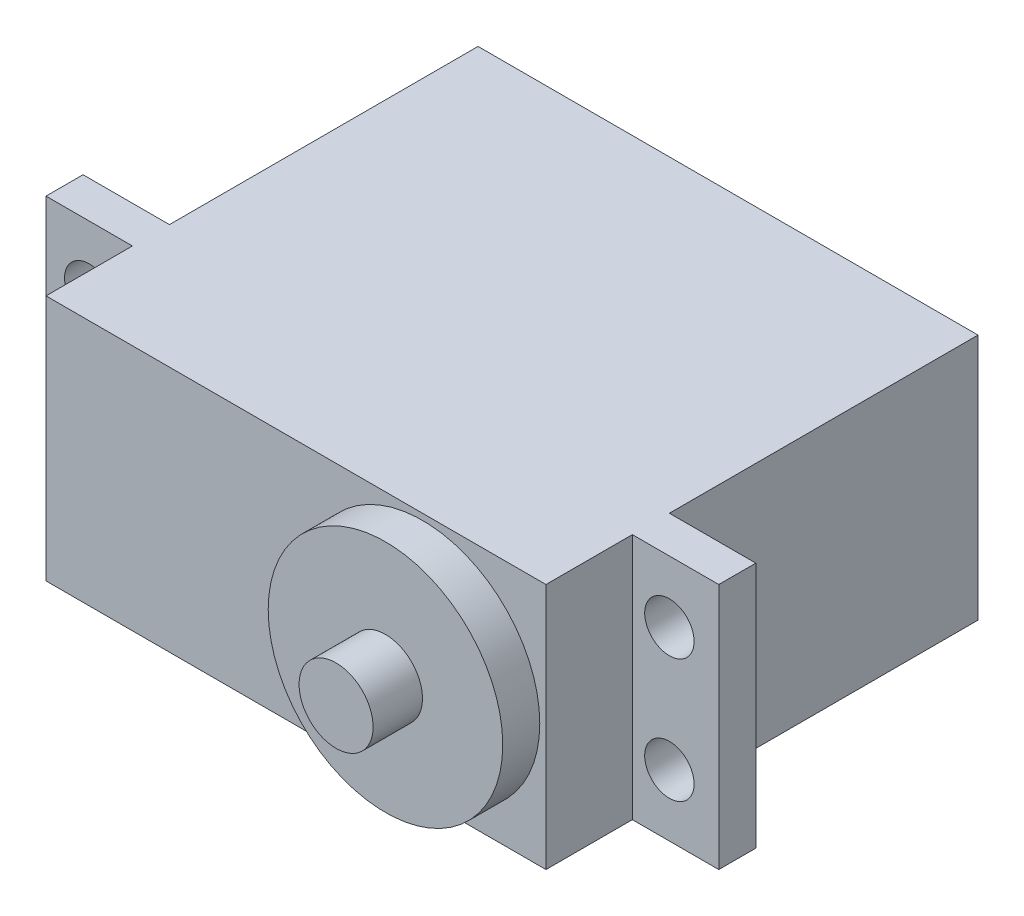
ISO-10303-21;
HEADER;
FILE_DESCRIPTION(('STEP AP214'),'2;1');
FILE_NAME('part.step','',(''),(''),'','','');
FILE_SCHEMA(('AUTOMOTIVE_DESIGN { 1 0 10303 214 1 1 1 1 }'));
ENDSEC;
DATA;
#1=APPLICATION_CONTEXT('core data for automotive mechanical design processes');
#2=APPLICATION_PROTOCOL_DEFINITION('international standard','automotive_design',2000,#1);
#3=PRODUCT_CONTEXT('',#1,'mechanical');
#4=PRODUCT('Part','Part','',(#3));
#5=PRODUCT_RELATED_PRODUCT_CATEGORY('part','',(#4));
#6=PRODUCT_DEFINITION_FORMATION('','',#4);
#7=PRODUCT_DEFINITION_CONTEXT('part definition',#1,'design');
#8=PRODUCT_DEFINITION('design','',#6,#7);
#9=PRODUCT_DEFINITION_SHAPE('','',#8);
#10=(LENGTH_UNIT() NAMED_UNIT(*) SI_UNIT(.MILLI.,.METRE.));
#11=(NAMED_UNIT(*) PLANE_ANGLE_UNIT() SI_UNIT($,.RADIAN.));
#12=(NAMED_UNIT(*) SI_UNIT($,.STERADIAN.) SOLID_ANGLE_UNIT());
#13=UNCERTAINTY_MEASURE_WITH_UNIT(LENGTH_MEASURE(1.E-05),#10,'distance_accuracy_value','');
#14=(GEOMETRIC_REPRESENTATION_CONTEXT(3) GLOBAL_UNCERTAINTY_ASSIGNED_CONTEXT((#13)) GLOBAL_UNIT_ASSIGNED_CONTEXT((#10,
#11,#12)) REPRESENTATION_CONTEXT('',''));
#15=CARTESIAN_POINT('',(0.,0.,0.));
#16=DIRECTION('',(0.,0.,1.));
#17=DIRECTION('',(1.,0.,0.));
#18=AXIS2_PLACEMENT_3D('',#15,#16,#17);
#19=CARTESIAN_POINT('',(-30.5,-10.,35.));
#20=DIRECTION('',(1.,0.,0.));
#21=DIRECTION('',(0.,0.,-1.));
#22=AXIS2_PLACEMENT_3D('',#19,#20,#21);
#23=PLANE('',#22);
#24=DIRECTION('',(0.,1.,0.));
#25=VECTOR('',#24,1.);
#26=CARTESIAN_POINT('',(-30.5,-10.,28.));
#27=LINE('',#26,#25);
#28=CARTESIAN_POINT('',(-30.5,-10.,28.));
#29=VERTEX_POINT('',#28);
#30=CARTESIAN_POINT('',(-30.5,10.,28.));
#31=VERTEX_POINT('',#30);
#32=EDGE_CURVE('E175',#29,#31,#27,.T.);
#33=ORIENTED_EDGE('',*,*,#32,.F.);
#34=DIRECTION('',(0.,0.,-1.));
#35=VECTOR('',#34,1.);
#36=CARTESIAN_POINT('',(-30.5,-10.,35.));
#37=LINE('',#36,#35);
#38=CARTESIAN_POINT('',(-30.5,-10.,35.));
#39=VERTEX_POINT('',#38);
#40=EDGE_CURVE('E144',#39,#29,#37,.T.);
#41=ORIENTED_EDGE('',*,*,#40,.F.);
#42=DIRECTION('',(0.,-1.,0.));
#43=VECTOR('',#42,1.);
#44=CARTESIAN_POINT('',(-30.5,-10.,35.));
#45=LINE('',#44,#43);
#46=CARTESIAN_POINT('',(-30.5,10.,35.));
#47=VERTEX_POINT('',#46);
#48=EDGE_CURVE('E181',#47,#39,#45,.T.);
#49=ORIENTED_EDGE('',*,*,#48,.F.);
#50=DIRECTION('',(0.,0.,-1.));
#51=VECTOR('',#50,1.);
#52=CARTESIAN_POINT('',(-30.5,10.,35.));
#53=LINE('',#52,#51);
#54=EDGE_CURVE('E215',#47,#31,#53,.T.);
#55=ORIENTED_EDGE('',*,*,#54,.T.);
#56=EDGE_LOOP('',(#33,#41,#49,#55));
#57=FACE_BOUND('',#56,.T.);
#58=ADVANCED_FACE('F44',(#57),#23,.F.);
#59=CARTESIAN_POINT('',(10.,-10.,35.));
#60=DIRECTION('',(-1.,0.,0.));
#61=DIRECTION('',(0.,0.,1.));
#62=AXIS2_PLACEMENT_3D('',#59,#60,#61);
#63=PLANE('',#62);
#64=DIRECTION('',(0.,-1.,0.));
#65=VECTOR('',#64,1.);
#66=CARTESIAN_POINT('',(10.,-10.,28.));
#67=LINE('',#66,#65);
#68=CARTESIAN_POINT('',(10.,10.,28.));
#69=VERTEX_POINT('',#68);
#70=CARTESIAN_POINT('',(10.,-10.,28.));
#71=VERTEX_POINT('',#70);
#72=EDGE_CURVE('E54',#69,#71,#67,.T.);
#73=ORIENTED_EDGE('',*,*,#72,.F.);
#74=DIRECTION('',(0.,0.,-1.));
#75=VECTOR('',#74,1.);
#76=CARTESIAN_POINT('',(10.,10.,35.));
#77=LINE('',#76,#75);
#78=CARTESIAN_POINT('',(10.,10.,35.));
#79=VERTEX_POINT('',#78);
#80=EDGE_CURVE('E220',#79,#69,#77,.T.);
#81=ORIENTED_EDGE('',*,*,#80,.F.);
#82=DIRECTION('',(0.,1.,0.));
#83=VECTOR('',#82,1.);
#84=CARTESIAN_POINT('',(10.,-10.,35.));
#85=LINE('',#84,#83);
#86=CARTESIAN_POINT('',(10.,-10.,35.));
#87=VERTEX_POINT('',#86);
#88=EDGE_CURVE('E191',#87,#79,#85,.T.);
#89=ORIENTED_EDGE('',*,*,#88,.F.);
#90=DIRECTION('',(0.,0.,-1.));
#91=VECTOR('',#90,1.);
#92=CARTESIAN_POINT('',(10.,-10.,35.));
#93=LINE('',#92,#91);
#94=EDGE_CURVE('E225',#87,#71,#93,.T.);
#95=ORIENTED_EDGE('',*,*,#94,.T.);
#96=EDGE_LOOP('',(#73,#81,#89,#95));
#97=FACE_BOUND('',#96,.T.);
#98=ADVANCED_FACE('F336',(#97),#63,.F.);
#99=CARTESIAN_POINT('',(-30.5,-10.,25.));
#100=VERTEX_POINT('',#99);
#101=CARTESIAN_POINT('',(-30.5,-10.,0.));
#102=VERTEX_POINT('',#101);
#103=EDGE_CURVE('E227',#100,#102,#37,.T.);
#104=ORIENTED_EDGE('',*,*,#103,.F.);
#105=DIRECTION('',(0.,1.,0.));
#106=VECTOR('',#105,1.);
#107=CARTESIAN_POINT('',(-30.5,-10.,25.));
#108=LINE('',#107,#106);
#109=CARTESIAN_POINT('',(-30.5,10.,25.));
#110=VERTEX_POINT('',#109);
#111=EDGE_CURVE('E167',#100,#110,#108,.T.);
#112=ORIENTED_EDGE('',*,*,#111,.T.);
#113=CARTESIAN_POINT('',(-30.5,10.,0.));
#114=VERTEX_POINT('',#113);
#115=EDGE_CURVE('E197',#110,#114,#53,.T.);
#116=ORIENTED_EDGE('',*,*,#115,.T.);
#117=DIRECTION('',(0.,-1.,0.));
#118=VECTOR('',#117,1.);
#119=CARTESIAN_POINT('',(-30.5,-10.,0.));
#120=LINE('',#119,#118);
#121=EDGE_CURVE('E185',#114,#102,#120,.T.);
#122=ORIENTED_EDGE('',*,*,#121,.T.);
#123=EDGE_LOOP('',(#104,#112,#116,#122));
#124=FACE_BOUND('',#123,.T.);
#125=ADVANCED_FACE('F50',(#124),#23,.F.);
#126=CARTESIAN_POINT('',(-30.5,-10.,35.));
#127=DIRECTION('',(0.,1.,0.));
#128=DIRECTION('',(0.,0.,1.));
#129=AXIS2_PLACEMENT_3D('',#126,#127,#128);
#130=PLANE('',#129);
#131=ORIENTED_EDGE('',*,*,#40,.T.);
#132=DIRECTION('',(1.,0.,0.));
#133=VECTOR('',#132,1.);
#134=CARTESIAN_POINT('',(-37.5,-10.,28.));
#135=LINE('',#134,#133);
#136=CARTESIAN_POINT('',(-37.5,-10.,28.));
#137=VERTEX_POINT('',#136);
#138=EDGE_CURVE('E137',#137,#29,#135,.T.);
#139=ORIENTED_EDGE('',*,*,#138,.F.);
#140=DIRECTION('',(0.,0.,-1.));
#141=VECTOR('',#140,1.);
#142=CARTESIAN_POINT('',(-37.5,-10.,28.));
#143=LINE('',#142,#141);
#144=CARTESIAN_POINT('',(-37.5,-10.,25.));
#145=VERTEX_POINT('',#144);
#146=EDGE_CURVE('E142',#137,#145,#143,.T.);
#147=ORIENTED_EDGE('',*,*,#146,.T.);
#148=DIRECTION('',(1.,0.,0.));
#149=VECTOR('',#148,1.);
#150=CARTESIAN_POINT('',(-37.5,-10.,25.));
#151=LINE('',#150,#149);
#152=EDGE_CURVE('E285',#145,#100,#151,.T.);
#153=ORIENTED_EDGE('',*,*,#152,.T.);
#154=ORIENTED_EDGE('',*,*,#103,.T.);
#155=DIRECTION('',(1.,0.,0.));
#156=VECTOR('',#155,1.);
#157=CARTESIAN_POINT('',(-30.5,-10.,0.));
#158=LINE('',#157,#156);
#159=CARTESIAN_POINT('',(10.,-10.,0.));
#160=VERTEX_POINT('',#159);
#161=EDGE_CURVE('E203',#102,#160,#158,.T.);
#162=ORIENTED_EDGE('',*,*,#161,.T.);
#163=CARTESIAN_POINT('',(10.,-10.,25.));
#164=VERTEX_POINT('',#163);
#165=EDGE_CURVE('E222',#164,#160,#93,.T.);
#166=ORIENTED_EDGE('',*,*,#165,.F.);
#167=CARTESIAN_POINT('',(17.,-10.,25.));
#168=VERTEX_POINT('',#167);
#169=EDGE_CURVE('E72',#164,#168,#151,.T.);
#170=ORIENTED_EDGE('',*,*,#169,.T.);
#171=DIRECTION('',(0.,0.,-1.));
#172=VECTOR('',#171,1.);
#173=CARTESIAN_POINT('',(17.,-10.,28.));
#174=LINE('',#173,#172);
#175=CARTESIAN_POINT('',(17.,-10.,28.));
#176=VERTEX_POINT('',#175);
#177=EDGE_CURVE('E170',#176,#168,#174,.T.);
#178=ORIENTED_EDGE('',*,*,#177,.F.);
#179=EDGE_CURVE('E147',#71,#176,#135,.T.);
#180=ORIENTED_EDGE('',*,*,#179,.F.);
#181=ORIENTED_EDGE('',*,*,#94,.F.);
#182=DIRECTION('',(1.,0.,0.));
#183=VECTOR('',#182,1.);
#184=CARTESIAN_POINT('',(-30.5,-10.,35.));
#185=LINE('',#184,#183);
#186=EDGE_CURVE('E190',#39,#87,#185,.T.);
#187=ORIENTED_EDGE('',*,*,#186,.F.);
#188=EDGE_LOOP('',(#131,#139,#147,#153,#154,#162,#166,#170,#178,#180,#181,#187));
#189=FACE_BOUND('',#188,.T.);
#190=ADVANCED_FACE('F138',(#189),#130,.F.);
#191=CARTESIAN_POINT('',(10.,10.,25.));
#192=VERTEX_POINT('',#191);
#193=CARTESIAN_POINT('',(10.,10.,0.));
#194=VERTEX_POINT('',#193);
#195=EDGE_CURVE('E216',#192,#194,#77,.T.);
#196=ORIENTED_EDGE('',*,*,#195,.F.);
#197=DIRECTION('',(0.,-1.,0.));
#198=VECTOR('',#197,1.);
#199=CARTESIAN_POINT('',(10.,-10.,25.));
#200=LINE('',#199,#198);
#201=EDGE_CURVE('E229',#192,#164,#200,.T.);
#202=ORIENTED_EDGE('',*,*,#201,.T.);
#203=ORIENTED_EDGE('',*,*,#165,.T.);
#204=DIRECTION('',(0.,1.,0.));
#205=VECTOR('',#204,1.);
#206=CARTESIAN_POINT('',(10.,-10.,0.));
#207=LINE('',#206,#205);
#208=EDGE_CURVE('E202',#160,#194,#207,.T.);
#209=ORIENTED_EDGE('',*,*,#208,.T.);
#210=EDGE_LOOP('',(#196,#202,#203,#209));
#211=FACE_BOUND('',#210,.T.);
#212=ADVANCED_FACE('F305',(#211),#63,.F.);
#213=CARTESIAN_POINT('',(-30.5,10.,35.));
#214=DIRECTION('',(0.,-1.,0.));
#215=DIRECTION('',(0.,0.,-1.));
#216=AXIS2_PLACEMENT_3D('',#213,#214,#215);
#217=PLANE('',#216);
#218=ORIENTED_EDGE('',*,*,#80,.T.);
#219=DIRECTION('',(-1.,0.,0.));
#220=VECTOR('',#219,1.);
#221=CARTESIAN_POINT('',(-37.5,10.,28.));
#222=LINE('',#221,#220);
#223=CARTESIAN_POINT('',(17.,10.,28.));
#224=VERTEX_POINT('',#223);
#225=EDGE_CURVE('E277',#224,#69,#222,.T.);
#226=ORIENTED_EDGE('',*,*,#225,.F.);
#227=DIRECTION('',(0.,0.,-1.));
#228=VECTOR('',#227,1.);
#229=CARTESIAN_POINT('',(17.,10.,28.));
#230=LINE('',#229,#228);
#231=CARTESIAN_POINT('',(17.,10.,25.));
#232=VERTEX_POINT('',#231);
#233=EDGE_CURVE('E176',#224,#232,#230,.T.);
#234=ORIENTED_EDGE('',*,*,#233,.T.);
#235=DIRECTION('',(-1.,0.,0.));
#236=VECTOR('',#235,1.);
#237=CARTESIAN_POINT('',(-37.5,10.,25.));
#238=LINE('',#237,#236);
#239=EDGE_CURVE('E161',#232,#192,#238,.T.);
#240=ORIENTED_EDGE('',*,*,#239,.T.);
#241=ORIENTED_EDGE('',*,*,#195,.T.);
#242=DIRECTION('',(-1.,0.,0.));
#243=VECTOR('',#242,1.);
#244=CARTESIAN_POINT('',(-30.5,10.,0.));
#245=LINE('',#244,#243);
#246=EDGE_CURVE('E188',#194,#114,#245,.T.);
#247=ORIENTED_EDGE('',*,*,#246,.T.);
#248=ORIENTED_EDGE('',*,*,#115,.F.);
#249=CARTESIAN_POINT('',(-37.5,10.,25.));
#250=VERTEX_POINT('',#249);
#251=EDGE_CURVE('E63',#110,#250,#238,.T.);
#252=ORIENTED_EDGE('',*,*,#251,.T.);
#253=DIRECTION('',(0.,0.,-1.));
#254=VECTOR('',#253,1.);
#255=CARTESIAN_POINT('',(-37.5,10.,28.));
#256=LINE('',#255,#254);
#257=CARTESIAN_POINT('',(-37.5,10.,28.));
#258=VERTEX_POINT('',#257);
#259=EDGE_CURVE('E276',#258,#250,#256,.T.);
#260=ORIENTED_EDGE('',*,*,#259,.F.);
#261=EDGE_CURVE('E156',#31,#258,#222,.T.);
#262=ORIENTED_EDGE('',*,*,#261,.F.);
#263=ORIENTED_EDGE('',*,*,#54,.F.);
#264=DIRECTION('',(-1.,0.,0.));
#265=VECTOR('',#264,1.);
#266=CARTESIAN_POINT('',(-30.5,10.,35.));
#267=LINE('',#266,#265);
#268=EDGE_CURVE('E193',#79,#47,#267,.T.);
#269=ORIENTED_EDGE('',*,*,#268,.F.);
#270=EDGE_LOOP('',(#218,#226,#234,#240,#241,#247,#248,#252,#260,#262,#263,#269));
#271=FACE_BOUND('',#270,.T.);
#272=ADVANCED_FACE('F298',(#271),#217,.F.);
#273=CARTESIAN_POINT('',(0.,0.,35.));
#274=DIRECTION('',(0.,0.,-1.));
#275=DIRECTION('',(-1.,0.,0.));
#276=AXIS2_PLACEMENT_3D('',#273,#274,#275);
#277=PLANE('',#276);
#278=CARTESIAN_POINT('',(0.,0.,35.));
#279=DIRECTION('',(0.,0.,-1.));
#280=DIRECTION('',(-1.,0.,0.));
#281=AXIS2_PLACEMENT_3D('',#278,#279,#280);
#282=CIRCLE('',#281,9.5);
#283=CARTESIAN_POINT('',(-9.5,0.,35.));
#284=VERTEX_POINT('',#283);
#285=EDGE_CURVE('E11',#284,#284,#282,.F.);
#286=ORIENTED_EDGE('',*,*,#285,.F.);
#287=EDGE_LOOP('',(#286));
#288=FACE_BOUND('',#287,.T.);
#289=ORIENTED_EDGE('',*,*,#48,.T.);
#290=ORIENTED_EDGE('',*,*,#186,.T.);
#291=ORIENTED_EDGE('',*,*,#88,.T.);
#292=ORIENTED_EDGE('',*,*,#268,.T.);
#293=EDGE_LOOP('',(#289,#290,#291,#292));
#294=FACE_BOUND('',#293,.T.);
#295=ADVANCED_FACE('F354',(#288,#294),#277,.F.);
#296=CARTESIAN_POINT('',(0.,0.,0.));
#297=DIRECTION('',(0.,0.,-1.));
#298=DIRECTION('',(-1.,0.,0.));
#299=AXIS2_PLACEMENT_3D('',#296,#297,#298);
#300=PLANE('',#299);
#301=ORIENTED_EDGE('',*,*,#121,.F.);
#302=ORIENTED_EDGE('',*,*,#246,.F.);
#303=ORIENTED_EDGE('',*,*,#208,.F.);
#304=ORIENTED_EDGE('',*,*,#161,.F.);
#305=EDGE_LOOP('',(#301,#302,#303,#304));
#306=FACE_BOUND('',#305,.T.);
#307=ADVANCED_FACE('F317',(#306),#300,.T.);
#308=CARTESIAN_POINT('',(17.,-10.,28.));
#309=DIRECTION('',(-1.,0.,0.));
#310=DIRECTION('',(0.,0.,1.));
#311=AXIS2_PLACEMENT_3D('',#308,#309,#310);
#312=PLANE('',#311);
#313=DIRECTION('',(0.,1.,0.));
#314=VECTOR('',#313,1.);
#315=CARTESIAN_POINT('',(17.,-10.,25.));
#316=LINE('',#315,#314);
#317=EDGE_CURVE('E281',#168,#232,#316,.T.);
#318=ORIENTED_EDGE('',*,*,#317,.T.);
#319=ORIENTED_EDGE('',*,*,#233,.F.);
#320=DIRECTION('',(0.,1.,0.));
#321=VECTOR('',#320,1.);
#322=CARTESIAN_POINT('',(17.,-10.,28.));
#323=LINE('',#322,#321);
#324=EDGE_CURVE('E149',#176,#224,#323,.T.);
#325=ORIENTED_EDGE('',*,*,#324,.F.);
#326=ORIENTED_EDGE('',*,*,#177,.T.);
#327=EDGE_LOOP('',(#318,#319,#325,#326));
#328=FACE_BOUND('',#327,.T.);
#329=ADVANCED_FACE('F357',(#328),#312,.F.);
#330=CARTESIAN_POINT('',(0.,0.,25.));
#331=DIRECTION('',(0.,0.,-1.));
#332=DIRECTION('',(-1.,0.,0.));
#333=AXIS2_PLACEMENT_3D('',#330,#331,#332);
#334=PLANE('',#333);
#335=CARTESIAN_POINT('',(13.,-5.,25.));
#336=DIRECTION('',(0.,0.,-1.));
#337=DIRECTION('',(-1.,0.,0.));
#338=AXIS2_PLACEMENT_3D('',#335,#336,#337);
#339=CIRCLE('',#338,2.);
#340=CARTESIAN_POINT('',(15.,-5.,25.));
#341=VERTEX_POINT('',#340);
#342=EDGE_CURVE('E266',#341,#341,#339,.T.);
#343=ORIENTED_EDGE('',*,*,#342,.F.);
#344=EDGE_LOOP('',(#343));
#345=FACE_BOUND('',#344,.T.);
#346=CARTESIAN_POINT('',(13.,5.,25.));
#347=DIRECTION('',(0.,0.,-1.));
#348=DIRECTION('',(-1.,0.,0.));
#349=AXIS2_PLACEMENT_3D('',#346,#347,#348);
#350=CIRCLE('',#349,2.);
#351=CARTESIAN_POINT('',(15.,5.,25.));
#352=VERTEX_POINT('',#351);
#353=EDGE_CURVE('E253',#352,#352,#350,.T.);
#354=ORIENTED_EDGE('',*,*,#353,.F.);
#355=EDGE_LOOP('',(#354));
#356=FACE_BOUND('',#355,.T.);
#357=ORIENTED_EDGE('',*,*,#201,.F.);
#358=ORIENTED_EDGE('',*,*,#239,.F.);
#359=ORIENTED_EDGE('',*,*,#317,.F.);
#360=ORIENTED_EDGE('',*,*,#169,.F.);
#361=EDGE_LOOP('',(#357,#358,#359,#360));
#362=FACE_BOUND('',#361,.T.);
#363=ADVANCED_FACE('F302',(#345,#356,#362),#334,.T.);
#364=CARTESIAN_POINT('',(0.,0.,28.));
#365=DIRECTION('',(0.,0.,-1.));
#366=DIRECTION('',(-1.,0.,0.));
#367=AXIS2_PLACEMENT_3D('',#364,#365,#366);
#368=PLANE('',#367);
#369=CARTESIAN_POINT('',(13.,-5.,28.));
#370=DIRECTION('',(0.,0.,-1.));
#371=DIRECTION('',(-1.,0.,0.));
#372=AXIS2_PLACEMENT_3D('',#369,#370,#371);
#373=CIRCLE('',#372,2.);
#374=CARTESIAN_POINT('',(15.,-5.,28.));
#375=VERTEX_POINT('',#374);
#376=EDGE_CURVE('E47',#375,#375,#373,.T.);
#377=ORIENTED_EDGE('',*,*,#376,.T.);
#378=EDGE_LOOP('',(#377));
#379=FACE_BOUND('',#378,.T.);
#380=CARTESIAN_POINT('',(13.,5.,28.));
#381=DIRECTION('',(0.,0.,-1.));
#382=DIRECTION('',(-1.,0.,0.));
#383=AXIS2_PLACEMENT_3D('',#380,#381,#382);
#384=CIRCLE('',#383,2.);
#385=CARTESIAN_POINT('',(15.,5.,28.));
#386=VERTEX_POINT('',#385);
#387=EDGE_CURVE('E249',#386,#386,#384,.T.);
#388=ORIENTED_EDGE('',*,*,#387,.T.);
#389=EDGE_LOOP('',(#388));
#390=FACE_BOUND('',#389,.T.);
#391=ORIENTED_EDGE('',*,*,#225,.T.);
#392=ORIENTED_EDGE('',*,*,#72,.T.);
#393=ORIENTED_EDGE('',*,*,#179,.T.);
#394=ORIENTED_EDGE('',*,*,#324,.T.);
#395=EDGE_LOOP('',(#391,#392,#393,#394));
#396=FACE_BOUND('',#395,.T.);
#397=ADVANCED_FACE('F324',(#379,#390,#396),#368,.F.);
#398=CARTESIAN_POINT('',(-34.,5.,28.));
#399=DIRECTION('',(0.,0.,-1.));
#400=DIRECTION('',(-1.,0.,0.));
#401=AXIS2_PLACEMENT_3D('',#398,#399,#400);
#402=CIRCLE('',#401,2.);
#403=CARTESIAN_POINT('',(-32.,5.,28.));
#404=VERTEX_POINT('',#403);
#405=EDGE_CURVE('E247',#404,#404,#402,.T.);
#406=ORIENTED_EDGE('',*,*,#405,.T.);
#407=EDGE_LOOP('',(#406));
#408=FACE_BOUND('',#407,.T.);
#409=CARTESIAN_POINT('',(-34.,-5.,28.));
#410=DIRECTION('',(0.,0.,-1.));
#411=DIRECTION('',(-1.,0.,0.));
#412=AXIS2_PLACEMENT_3D('',#409,#410,#411);
#413=CIRCLE('',#412,2.);
#414=CARTESIAN_POINT('',(-32.,-5.,28.));
#415=VERTEX_POINT('',#414);
#416=EDGE_CURVE('E243',#415,#415,#413,.T.);
#417=ORIENTED_EDGE('',*,*,#416,.T.);
#418=EDGE_LOOP('',(#417));
#419=FACE_BOUND('',#418,.T.);
#420=ORIENTED_EDGE('',*,*,#138,.T.);
#421=ORIENTED_EDGE('',*,*,#32,.T.);
#422=ORIENTED_EDGE('',*,*,#261,.T.);
#423=DIRECTION('',(0.,-1.,0.));
#424=VECTOR('',#423,1.);
#425=CARTESIAN_POINT('',(-37.5,-10.,28.));
#426=LINE('',#425,#424);
#427=EDGE_CURVE('E153',#258,#137,#426,.T.);
#428=ORIENTED_EDGE('',*,*,#427,.T.);
#429=EDGE_LOOP('',(#420,#421,#422,#428));
#430=FACE_BOUND('',#429,.T.);
#431=ADVANCED_FACE('F152',(#408,#419,#430),#368,.F.);
#432=CARTESIAN_POINT('',(-34.,5.,25.));
#433=DIRECTION('',(0.,0.,-1.));
#434=DIRECTION('',(-1.,0.,0.));
#435=AXIS2_PLACEMENT_3D('',#432,#433,#434);
#436=CIRCLE('',#435,2.);
#437=CARTESIAN_POINT('',(-32.,5.,25.));
#438=VERTEX_POINT('',#437);
#439=EDGE_CURVE('E244',#438,#438,#436,.T.);
#440=ORIENTED_EDGE('',*,*,#439,.F.);
#441=EDGE_LOOP('',(#440));
#442=FACE_BOUND('',#441,.T.);
#443=CARTESIAN_POINT('',(-34.,-5.,25.));
#444=DIRECTION('',(0.,0.,-1.));
#445=DIRECTION('',(-1.,0.,0.));
#446=AXIS2_PLACEMENT_3D('',#443,#444,#445);
#447=CIRCLE('',#446,2.);
#448=CARTESIAN_POINT('',(-32.,-5.,25.));
#449=VERTEX_POINT('',#448);
#450=EDGE_CURVE('E238',#449,#449,#447,.T.);
#451=ORIENTED_EDGE('',*,*,#450,.F.);
#452=EDGE_LOOP('',(#451));
#453=FACE_BOUND('',#452,.T.);
#454=ORIENTED_EDGE('',*,*,#111,.F.);
#455=ORIENTED_EDGE('',*,*,#152,.F.);
#456=DIRECTION('',(0.,-1.,0.));
#457=VECTOR('',#456,1.);
#458=CARTESIAN_POINT('',(-37.5,-10.,25.));
#459=LINE('',#458,#457);
#460=EDGE_CURVE('E163',#250,#145,#459,.T.);
#461=ORIENTED_EDGE('',*,*,#460,.F.);
#462=ORIENTED_EDGE('',*,*,#251,.F.);
#463=EDGE_LOOP('',(#454,#455,#461,#462));
#464=FACE_BOUND('',#463,.T.);
#465=ADVANCED_FACE('F311',(#442,#453,#464),#334,.T.);
#466=CARTESIAN_POINT('',(-37.5,-10.,28.));
#467=DIRECTION('',(1.,0.,0.));
#468=DIRECTION('',(0.,0.,-1.));
#469=AXIS2_PLACEMENT_3D('',#466,#467,#468);
#470=PLANE('',#469);
#471=ORIENTED_EDGE('',*,*,#460,.T.);
#472=ORIENTED_EDGE('',*,*,#146,.F.);
#473=ORIENTED_EDGE('',*,*,#427,.F.);
#474=ORIENTED_EDGE('',*,*,#259,.T.);
#475=EDGE_LOOP('',(#471,#472,#473,#474));
#476=FACE_BOUND('',#475,.T.);
#477=ADVANCED_FACE('F162',(#476),#470,.F.);
#478=CARTESIAN_POINT('',(0.,0.,38.));
#479=DIRECTION('',(0.,0.,-1.));
#480=DIRECTION('',(-1.,0.,0.));
#481=AXIS2_PLACEMENT_3D('',#478,#479,#480);
#482=CYLINDRICAL_SURFACE('',#481,9.5);
#483=CARTESIAN_POINT('',(0.,0.,38.));
#484=DIRECTION('',(0.,0.,1.));
#485=DIRECTION('',(1.,0.,0.));
#486=AXIS2_PLACEMENT_3D('',#483,#484,#485);
#487=CIRCLE('',#486,9.5);
#488=CARTESIAN_POINT('',(9.5,0.,38.));
#489=VERTEX_POINT('',#488);
#490=EDGE_CURVE('E236',#489,#489,#487,.T.);
#491=ORIENTED_EDGE('',*,*,#490,.F.);
#492=EDGE_LOOP('',(#491));
#493=FACE_BOUND('',#492,.T.);
#494=ORIENTED_EDGE('',*,*,#285,.T.);
#495=EDGE_LOOP('',(#494));
#496=FACE_BOUND('',#495,.T.);
#497=ADVANCED_FACE('F361',(#493,#496),#482,.T.);
#498=CARTESIAN_POINT('',(0.,0.,38.));
#499=DIRECTION('',(0.,0.,1.));
#500=DIRECTION('',(1.,0.,0.));
#501=AXIS2_PLACEMENT_3D('',#498,#499,#500);
#502=PLANE('',#501);
#503=CARTESIAN_POINT('',(0.,0.,38.));
#504=DIRECTION('',(0.,0.,1.));
#505=DIRECTION('',(1.,0.,0.));
#506=AXIS2_PLACEMENT_3D('',#503,#504,#505);
#507=CIRCLE('',#506,3.);
#508=CARTESIAN_POINT('',(-3.,0.,38.));
#509=VERTEX_POINT('',#508);
#510=EDGE_CURVE('E233',#509,#509,#507,.F.);
#511=ORIENTED_EDGE('',*,*,#510,.T.);
#512=EDGE_LOOP('',(#511));
#513=FACE_BOUND('',#512,.T.);
#514=ORIENTED_EDGE('',*,*,#490,.T.);
#515=EDGE_LOOP('',(#514));
#516=FACE_BOUND('',#515,.T.);
#517=ADVANCED_FACE('F373',(#513,#516),#502,.T.);
#518=CARTESIAN_POINT('',(0.,0.,42.));
#519=DIRECTION('',(0.,0.,-1.));
#520=DIRECTION('',(-1.,0.,0.));
#521=AXIS2_PLACEMENT_3D('',#518,#519,#520);
#522=CYLINDRICAL_SURFACE('',#521,3.);
#523=CARTESIAN_POINT('',(0.,0.,42.));
#524=DIRECTION('',(0.,0.,1.));
#525=DIRECTION('',(1.,0.,0.));
#526=AXIS2_PLACEMENT_3D('',#523,#524,#525);
#527=CIRCLE('',#526,3.);
#528=CARTESIAN_POINT('',(-3.,0.,42.));
#529=VERTEX_POINT('',#528);
#530=EDGE_CURVE('E239',#529,#529,#527,.T.);
#531=CARTESIAN_POINT('',(-3.,0.,38.));
#532=CARTESIAN_POINT('',(-3.,0.,38.0416666666667));
#533=CARTESIAN_POINT('',(-3.,0.,38.0833333333333));
#534=CARTESIAN_POINT('',(-3.,0.,38.1666666666667));
#535=CARTESIAN_POINT('',(-3.,0.,38.2083333333333));
#536=CARTESIAN_POINT('',(-3.,0.,38.2916666666667));
#537=CARTESIAN_POINT('',(-3.,0.,38.3333333333333));
#538=CARTESIAN_POINT('',(-3.,0.,38.4166666666667));
#539=CARTESIAN_POINT('',(-3.,0.,38.4583333333333));
#540=CARTESIAN_POINT('',(-3.,0.,38.5416666666667));
#541=CARTESIAN_POINT('',(-3.,0.,38.5833333333333));
#542=CARTESIAN_POINT('',(-3.,0.,38.6666666666667));
#543=CARTESIAN_POINT('',(-3.,0.,38.7083333333333));
#544=CARTESIAN_POINT('',(-3.,0.,38.7916666666667));
#545=CARTESIAN_POINT('',(-3.,0.,38.8333333333333));
#546=CARTESIAN_POINT('',(-3.,0.,38.9166666666667));
#547=CARTESIAN_POINT('',(-3.,0.,38.9583333333333));
#548=CARTESIAN_POINT('',(-3.,0.,39.0416666666667));
#549=CARTESIAN_POINT('',(-3.,0.,39.0833333333333));
#550=CARTESIAN_POINT('',(-3.,0.,39.1666666666667));
#551=CARTESIAN_POINT('',(-3.,0.,39.2083333333333));
#552=CARTESIAN_POINT('',(-3.,0.,39.2916666666667));
#553=CARTESIAN_POINT('',(-3.,0.,39.3333333333333));
#554=CARTESIAN_POINT('',(-3.,0.,39.4166666666667));
#555=CARTESIAN_POINT('',(-3.,0.,39.4583333333333));
#556=CARTESIAN_POINT('',(-3.,0.,39.5416666666667));
#557=CARTESIAN_POINT('',(-3.,0.,39.5833333333333));
#558=CARTESIAN_POINT('',(-3.,0.,39.6666666666667));
#559=CARTESIAN_POINT('',(-3.,0.,39.7083333333333));
#560=CARTESIAN_POINT('',(-3.,0.,39.7916666666667));
#561=CARTESIAN_POINT('',(-3.,0.,39.8333333333333));
#562=CARTESIAN_POINT('',(-3.,0.,39.9166666666667));
#563=CARTESIAN_POINT('',(-3.,0.,39.9583333333333));
#564=CARTESIAN_POINT('',(-3.,0.,40.0416666666667));
#565=CARTESIAN_POINT('',(-3.,0.,40.0833333333333));
#566=CARTESIAN_POINT('',(-3.,0.,40.1666666666667));
#567=CARTESIAN_POINT('',(-3.,0.,40.2083333333333));
#568=CARTESIAN_POINT('',(-3.,0.,40.2916666666667));
#569=CARTESIAN_POINT('',(-3.,0.,40.3333333333333));
#570=CARTESIAN_POINT('',(-3.,0.,40.4166666666667));
#571=CARTESIAN_POINT('',(-3.,0.,40.4583333333333));
#572=CARTESIAN_POINT('',(-3.,0.,40.5416666666667));
#573=CARTESIAN_POINT('',(-3.,0.,40.5833333333333));
#574=CARTESIAN_POINT('',(-3.,0.,40.6666666666667));
#575=CARTESIAN_POINT('',(-3.,0.,40.7083333333333));
#576=CARTESIAN_POINT('',(-3.,0.,40.7916666666667));
#577=CARTESIAN_POINT('',(-3.,0.,40.8333333333333));
#578=CARTESIAN_POINT('',(-3.,0.,40.9166666666667));
#579=CARTESIAN_POINT('',(-3.,0.,40.9583333333333));
#580=CARTESIAN_POINT('',(-3.,0.,41.0416666666667));
#581=CARTESIAN_POINT('',(-3.,0.,41.0833333333333));
#582=CARTESIAN_POINT('',(-3.,0.,41.1666666666667));
#583=CARTESIAN_POINT('',(-3.,0.,41.2083333333333));
#584=CARTESIAN_POINT('',(-3.,0.,41.2916666666667));
#585=CARTESIAN_POINT('',(-3.,0.,41.3333333333333));
#586=CARTESIAN_POINT('',(-3.,0.,41.4166666666667));
#587=CARTESIAN_POINT('',(-3.,0.,41.4583333333333));
#588=CARTESIAN_POINT('',(-3.,0.,41.5416666666667));
#589=CARTESIAN_POINT('',(-3.,0.,41.5833333333333));
#590=CARTESIAN_POINT('',(-3.,0.,41.6666666666667));
#591=CARTESIAN_POINT('',(-3.,0.,41.7083333333333));
#592=CARTESIAN_POINT('',(-3.,0.,41.7916666666667));
#593=CARTESIAN_POINT('',(-3.,0.,41.8333333333333));
#594=CARTESIAN_POINT('',(-3.,0.,41.9166666666667));
#595=CARTESIAN_POINT('',(-3.,0.,41.9583333333333));
#596=CARTESIAN_POINT('',(-3.,0.,42.));
#597=B_SPLINE_CURVE_WITH_KNOTS('',3,(#531,#532,#533,#534,#535,#536,#537,#538,#539,#540,#541,
#542,#543,#544,#545,#546,#547,#548,#549,#550,#551,#552,#553,#554,#555,#556,#557,#558,#559,#560,
#561,#562,#563,#564,#565,#566,#567,#568,#569,#570,#571,#572,#573,#574,#575,#576,#577,#578,#579,
#580,#581,#582,#583,#584,#585,#586,#587,#588,#589,#590,#591,#592,#593,#594,#595,#596),
.UNSPECIFIED.,.F.,.F.,(4,2,2,2,2,2,2,2,2,2,2,2,2,2,2,2,2,2,2,2,2,2,2,2,2,2,2,2,2,2,2,2,4),(0.,
0.125,0.25,0.375,0.5,0.625000000000001,0.750000000000001,0.875000000000001,1.,1.125,1.25,1.375,
1.5,1.625,1.75,1.875,2.,2.125,2.25,2.375,2.5,2.625,2.75,2.875,3.,3.125,3.25,3.375,3.5,3.625,
3.75,3.875,4.),.UNSPECIFIED.);
#598=EDGE_CURVE('BSEAM380',#509,#529,#597,.T.);
#599=ORIENTED_EDGE('',*,*,#510,.F.);
#600=ORIENTED_EDGE('',*,*,#530,.F.);
#601=ORIENTED_EDGE('',*,*,#598,.T.);
#602=ORIENTED_EDGE('',*,*,#598,.F.);
#603=EDGE_LOOP('',(#599,#601,#600,#602));
#604=FACE_BOUND('',#603,.T.);
#605=ADVANCED_FACE('F380',(#604),#522,.T.);
#606=CARTESIAN_POINT('',(0.,0.,42.));
#607=DIRECTION('',(0.,0.,1.));
#608=DIRECTION('',(1.,0.,0.));
#609=AXIS2_PLACEMENT_3D('',#606,#607,#608);
#610=PLANE('',#609);
#611=ORIENTED_EDGE('',*,*,#530,.T.);
#612=EDGE_LOOP('',(#611));
#613=FACE_BOUND('',#612,.T.);
#614=ADVANCED_FACE('F381',(#613),#610,.T.);
#615=CARTESIAN_POINT('',(-34.,-5.,-1.2E-05));
#616=DIRECTION('',(0.,0.,1.));
#617=DIRECTION('',(1.,0.,0.));
#618=AXIS2_PLACEMENT_3D('',#615,#616,#617);
#619=CYLINDRICAL_SURFACE('',#618,2.);
#620=CARTESIAN_POINT('',(-32.,-5.,25.));
#621=CARTESIAN_POINT('',(-32.,-5.,25.03125));
#622=CARTESIAN_POINT('',(-32.,-5.,25.0625));
#623=CARTESIAN_POINT('',(-32.,-5.,25.125));
#624=CARTESIAN_POINT('',(-32.,-5.,25.15625));
#625=CARTESIAN_POINT('',(-32.,-5.,25.21875));
#626=CARTESIAN_POINT('',(-32.,-5.,25.25));
#627=CARTESIAN_POINT('',(-32.,-5.,25.3125));
#628=CARTESIAN_POINT('',(-32.,-5.,25.34375));
#629=CARTESIAN_POINT('',(-32.,-5.,25.40625));
#630=CARTESIAN_POINT('',(-32.,-5.,25.4375));
#631=CARTESIAN_POINT('',(-32.,-5.,25.5));
#632=CARTESIAN_POINT('',(-32.,-5.,25.53125));
#633=CARTESIAN_POINT('',(-32.,-5.,25.59375));
#634=CARTESIAN_POINT('',(-32.,-5.,25.625));
#635=CARTESIAN_POINT('',(-32.,-5.,25.6875));
#636=CARTESIAN_POINT('',(-32.,-5.,25.71875));
#637=CARTESIAN_POINT('',(-32.,-5.,25.78125));
#638=CARTESIAN_POINT('',(-32.,-5.,25.8125));
#639=CARTESIAN_POINT('',(-32.,-5.,25.875));
#640=CARTESIAN_POINT('',(-32.,-5.,25.90625));
#641=CARTESIAN_POINT('',(-32.,-5.,25.96875));
#642=CARTESIAN_POINT('',(-32.,-5.,26.));
#643=CARTESIAN_POINT('',(-32.,-5.,26.0625));
#644=CARTESIAN_POINT('',(-32.,-5.,26.09375));
#645=CARTESIAN_POINT('',(-32.,-5.,26.15625));
#646=CARTESIAN_POINT('',(-32.,-5.,26.1875));
#647=CARTESIAN_POINT('',(-32.,-5.,26.25));
#648=CARTESIAN_POINT('',(-32.,-5.,26.28125));
#649=CARTESIAN_POINT('',(-32.,-5.,26.34375));
#650=CARTESIAN_POINT('',(-32.,-5.,26.375));
#651=CARTESIAN_POINT('',(-32.,-5.,26.4375));
#652=CARTESIAN_POINT('',(-32.,-5.,26.46875));
#653=CARTESIAN_POINT('',(-32.,-5.,26.53125));
#654=CARTESIAN_POINT('',(-32.,-5.,26.5625));
#655=CARTESIAN_POINT('',(-32.,-5.,26.625));
#656=CARTESIAN_POINT('',(-32.,-5.,26.65625));
#657=CARTESIAN_POINT('',(-32.,-5.,26.71875));
#658=CARTESIAN_POINT('',(-32.,-5.,26.75));
#659=CARTESIAN_POINT('',(-32.,-5.,26.8125));
#660=CARTESIAN_POINT('',(-32.,-5.,26.84375));
#661=CARTESIAN_POINT('',(-32.,-5.,26.90625));
#662=CARTESIAN_POINT('',(-32.,-5.,26.9375));
#663=CARTESIAN_POINT('',(-32.,-5.,27.));
#664=CARTESIAN_POINT('',(-32.,-5.,27.03125));
#665=CARTESIAN_POINT('',(-32.,-5.,27.09375));
#666=CARTESIAN_POINT('',(-32.,-5.,27.125));
#667=CARTESIAN_POINT('',(-32.,-5.,27.1875));
#668=CARTESIAN_POINT('',(-32.,-5.,27.21875));
#669=CARTESIAN_POINT('',(-32.,-5.,27.28125));
#670=CARTESIAN_POINT('',(-32.,-5.,27.3125));
#671=CARTESIAN_POINT('',(-32.,-5.,27.375));
#672=CARTESIAN_POINT('',(-32.,-5.,27.40625));
#673=CARTESIAN_POINT('',(-32.,-5.,27.46875));
#674=CARTESIAN_POINT('',(-32.,-5.,27.5));
#675=CARTESIAN_POINT('',(-32.,-5.,27.5625));
#676=CARTESIAN_POINT('',(-32.,-5.,27.59375));
#677=CARTESIAN_POINT('',(-32.,-5.,27.65625));
#678=CARTESIAN_POINT('',(-32.,-5.,27.6875));
#679=CARTESIAN_POINT('',(-32.,-5.,27.75));
#680=CARTESIAN_POINT('',(-32.,-5.,27.78125));
#681=CARTESIAN_POINT('',(-32.,-5.,27.84375));
#682=CARTESIAN_POINT('',(-32.,-5.,27.875));
#683=CARTESIAN_POINT('',(-32.,-5.,27.9375));
#684=CARTESIAN_POINT('',(-32.,-5.,27.96875));
#685=CARTESIAN_POINT('',(-32.,-5.,28.));
#686=B_SPLINE_CURVE_WITH_KNOTS('',3,(#620,#621,#622,#623,#624,#625,#626,#627,#628,#629,#630,
#631,#632,#633,#634,#635,#636,#637,#638,#639,#640,#641,#642,#643,#644,#645,#646,#647,#648,#649,
#650,#651,#652,#653,#654,#655,#656,#657,#658,#659,#660,#661,#662,#663,#664,#665,#666,#667,#668,
#669,#670,#671,#672,#673,#674,#675,#676,#677,#678,#679,#680,#681,#682,#683,#684,#685),
.UNSPECIFIED.,.F.,.F.,(4,2,2,2,2,2,2,2,2,2,2,2,2,2,2,2,2,2,2,2,2,2,2,2,2,2,2,2,2,2,2,2,4),(0.,
0.0937500000000001,0.1875,0.28125,0.375,0.46875,0.5625,0.656250000000001,0.750000000000001,
0.843749999999997,0.937499999999997,1.03125,1.125,1.21875,1.3125,1.40625,1.5,1.59375,1.6875,
1.78125,1.875,1.96875,2.0625,2.15625,2.25,2.34375,2.4375,2.53125,2.625,2.71875,2.8125,2.90625,
3.),.UNSPECIFIED.);
#687=EDGE_CURVE('BSEAM383',#449,#415,#686,.T.);
#688=ORIENTED_EDGE('',*,*,#450,.T.);
#689=ORIENTED_EDGE('',*,*,#416,.F.);
#690=ORIENTED_EDGE('',*,*,#687,.T.);
#691=ORIENTED_EDGE('',*,*,#687,.F.);
#692=EDGE_LOOP('',(#688,#690,#689,#691));
#693=FACE_BOUND('',#692,.T.);
#694=ADVANCED_FACE('F383',(#693),#619,.F.);
#695=CARTESIAN_POINT('',(-34.,5.,-1.2E-05));
#696=DIRECTION('',(0.,0.,1.));
#697=DIRECTION('',(1.,0.,0.));
#698=AXIS2_PLACEMENT_3D('',#695,#696,#697);
#699=CYLINDRICAL_SURFACE('',#698,2.);
#700=CARTESIAN_POINT('',(-32.,5.,25.));
#701=CARTESIAN_POINT('',(-32.,5.,25.03125));
#702=CARTESIAN_POINT('',(-32.,5.,25.0625));
#703=CARTESIAN_POINT('',(-32.,5.,25.125));
#704=CARTESIAN_POINT('',(-32.,5.,25.15625));
#705=CARTESIAN_POINT('',(-32.,5.,25.21875));
#706=CARTESIAN_POINT('',(-32.,5.,25.25));
#707=CARTESIAN_POINT('',(-32.,5.,25.3125));
#708=CARTESIAN_POINT('',(-32.,5.,25.34375));
#709=CARTESIAN_POINT('',(-32.,5.,25.40625));
#710=CARTESIAN_POINT('',(-32.,5.,25.4375));
#711=CARTESIAN_POINT('',(-32.,5.,25.5));
#712=CARTESIAN_POINT('',(-32.,5.,25.53125));
#713=CARTESIAN_POINT('',(-32.,5.,25.59375));
#714=CARTESIAN_POINT('',(-32.,5.,25.625));
#715=CARTESIAN_POINT('',(-32.,5.,25.6875));
#716=CARTESIAN_POINT('',(-32.,5.,25.71875));
#717=CARTESIAN_POINT('',(-32.,5.,25.78125));
#718=CARTESIAN_POINT('',(-32.,5.,25.8125));
#719=CARTESIAN_POINT('',(-32.,5.,25.875));
#720=CARTESIAN_POINT('',(-32.,5.,25.90625));
#721=CARTESIAN_POINT('',(-32.,5.,25.96875));
#722=CARTESIAN_POINT('',(-32.,5.,26.));
#723=CARTESIAN_POINT('',(-32.,5.,26.0625));
#724=CARTESIAN_POINT('',(-32.,5.,26.09375));
#725=CARTESIAN_POINT('',(-32.,5.,26.15625));
#726=CARTESIAN_POINT('',(-32.,5.,26.1875));
#727=CARTESIAN_POINT('',(-32.,5.,26.25));
#728=CARTESIAN_POINT('',(-32.,5.,26.28125));
#729=CARTESIAN_POINT('',(-32.,5.,26.34375));
#730=CARTESIAN_POINT('',(-32.,5.,26.375));
#731=CARTESIAN_POINT('',(-32.,5.,26.4375));
#732=CARTESIAN_POINT('',(-32.,5.,26.46875));
#733=CARTESIAN_POINT('',(-32.,5.,26.53125));
#734=CARTESIAN_POINT('',(-32.,5.,26.5625));
#735=CARTESIAN_POINT('',(-32.,5.,26.625));
#736=CARTESIAN_POINT('',(-32.,5.,26.65625));
#737=CARTESIAN_POINT('',(-32.,5.,26.71875));
#738=CARTESIAN_POINT('',(-32.,5.,26.75));
#739=CARTESIAN_POINT('',(-32.,5.,26.8125));
#740=CARTESIAN_POINT('',(-32.,5.,26.84375));
#741=CARTESIAN_POINT('',(-32.,5.,26.90625));
#742=CARTESIAN_POINT('',(-32.,5.,26.9375));
#743=CARTESIAN_POINT('',(-32.,5.,27.));
#744=CARTESIAN_POINT('',(-32.,5.,27.03125));
#745=CARTESIAN_POINT('',(-32.,5.,27.09375));
#746=CARTESIAN_POINT('',(-32.,5.,27.125));
#747=CARTESIAN_POINT('',(-32.,5.,27.1875));
#748=CARTESIAN_POINT('',(-32.,5.,27.21875));
#749=CARTESIAN_POINT('',(-32.,5.,27.28125));
#750=CARTESIAN_POINT('',(-32.,5.,27.3125));
#751=CARTESIAN_POINT('',(-32.,5.,27.375));
#752=CARTESIAN_POINT('',(-32.,5.,27.40625));
#753=CARTESIAN_POINT('',(-32.,5.,27.46875));
#754=CARTESIAN_POINT('',(-32.,5.,27.5));
#755=CARTESIAN_POINT('',(-32.,5.,27.5625));
#756=CARTESIAN_POINT('',(-32.,5.,27.59375));
#757=CARTESIAN_POINT('',(-32.,5.,27.65625));
#758=CARTESIAN_POINT('',(-32.,5.,27.6875));
#759=CARTESIAN_POINT('',(-32.,5.,27.75));
#760=CARTESIAN_POINT('',(-32.,5.,27.78125));
#761=CARTESIAN_POINT('',(-32.,5.,27.84375));
#762=CARTESIAN_POINT('',(-32.,5.,27.875));
#763=CARTESIAN_POINT('',(-32.,5.,27.9375));
#764=CARTESIAN_POINT('',(-32.,5.,27.96875));
#765=CARTESIAN_POINT('',(-32.,5.,28.));
#766=B_SPLINE_CURVE_WITH_KNOTS('',3,(#700,#701,#702,#703,#704,#705,#706,#707,#708,#709,#710,
#711,#712,#713,#714,#715,#716,#717,#718,#719,#720,#721,#722,#723,#724,#725,#726,#727,#728,#729,
#730,#731,#732,#733,#734,#735,#736,#737,#738,#739,#740,#741,#742,#743,#744,#745,#746,#747,#748,
#749,#750,#751,#752,#753,#754,#755,#756,#757,#758,#759,#760,#761,#762,#763,#764,#765),
.UNSPECIFIED.,.F.,.F.,(4,2,2,2,2,2,2,2,2,2,2,2,2,2,2,2,2,2,2,2,2,2,2,2,2,2,2,2,2,2,2,2,4),(0.,
0.0937500000000001,0.1875,0.28125,0.375,0.46875,0.5625,0.656250000000001,0.750000000000001,
0.843749999999997,0.937499999999997,1.03125,1.125,1.21875,1.3125,1.40625,1.5,1.59375,1.6875,
1.78125,1.875,1.96875,2.0625,2.15625,2.25,2.34375,2.4375,2.53125,2.625,2.71875,2.8125,2.90625,
3.),.UNSPECIFIED.);
#767=EDGE_CURVE('BSEAM331',#438,#404,#766,.T.);
#768=ORIENTED_EDGE('',*,*,#439,.T.);
#769=ORIENTED_EDGE('',*,*,#405,.F.);
#770=ORIENTED_EDGE('',*,*,#767,.T.);
#771=ORIENTED_EDGE('',*,*,#767,.F.);
#772=EDGE_LOOP('',(#768,#770,#769,#771));
#773=FACE_BOUND('',#772,.T.);
#774=ADVANCED_FACE('F331',(#773),#699,.F.);
#775=CARTESIAN_POINT('',(13.,5.,-1.2E-05));
#776=DIRECTION('',(0.,0.,1.));
#777=DIRECTION('',(1.,0.,0.));
#778=AXIS2_PLACEMENT_3D('',#775,#776,#777);
#779=CYLINDRICAL_SURFACE('',#778,2.);
#780=CARTESIAN_POINT('',(15.,5.,25.));
#781=CARTESIAN_POINT('',(15.,5.,25.03125));
#782=CARTESIAN_POINT('',(15.,5.,25.0625));
#783=CARTESIAN_POINT('',(15.,5.,25.125));
#784=CARTESIAN_POINT('',(15.,5.,25.15625));
#785=CARTESIAN_POINT('',(15.,5.,25.21875));
#786=CARTESIAN_POINT('',(15.,5.,25.25));
#787=CARTESIAN_POINT('',(15.,5.,25.3125));
#788=CARTESIAN_POINT('',(15.,5.,25.34375));
#789=CARTESIAN_POINT('',(15.,5.,25.40625));
#790=CARTESIAN_POINT('',(15.,5.,25.4375));
#791=CARTESIAN_POINT('',(15.,5.,25.5));
#792=CARTESIAN_POINT('',(15.,5.,25.53125));
#793=CARTESIAN_POINT('',(15.,5.,25.59375));
#794=CARTESIAN_POINT('',(15.,5.,25.625));
#795=CARTESIAN_POINT('',(15.,5.,25.6875));
#796=CARTESIAN_POINT('',(15.,5.,25.71875));
#797=CARTESIAN_POINT('',(15.,5.,25.78125));
#798=CARTESIAN_POINT('',(15.,5.,25.8125));
#799=CARTESIAN_POINT('',(15.,5.,25.875));
#800=CARTESIAN_POINT('',(15.,5.,25.90625));
#801=CARTESIAN_POINT('',(15.,5.,25.96875));
#802=CARTESIAN_POINT('',(15.,5.,26.));
#803=CARTESIAN_POINT('',(15.,5.,26.0625));
#804=CARTESIAN_POINT('',(15.,5.,26.09375));
#805=CARTESIAN_POINT('',(15.,5.,26.15625));
#806=CARTESIAN_POINT('',(15.,5.,26.1875));
#807=CARTESIAN_POINT('',(15.,5.,26.25));
#808=CARTESIAN_POINT('',(15.,5.,26.28125));
#809=CARTESIAN_POINT('',(15.,5.,26.34375));
#810=CARTESIAN_POINT('',(15.,5.,26.375));
#811=CARTESIAN_POINT('',(15.,5.,26.4375));
#812=CARTESIAN_POINT('',(15.,5.,26.46875));
#813=CARTESIAN_POINT('',(15.,5.,26.53125));
#814=CARTESIAN_POINT('',(15.,5.,26.5625));
#815=CARTESIAN_POINT('',(15.,5.,26.625));
#816=CARTESIAN_POINT('',(15.,5.,26.65625));
#817=CARTESIAN_POINT('',(15.,5.,26.71875));
#818=CARTESIAN_POINT('',(15.,5.,26.75));
#819=CARTESIAN_POINT('',(15.,5.,26.8125));
#820=CARTESIAN_POINT('',(15.,5.,26.84375));
#821=CARTESIAN_POINT('',(15.,5.,26.90625));
#822=CARTESIAN_POINT('',(15.,5.,26.9375));
#823=CARTESIAN_POINT('',(15.,5.,27.));
#824=CARTESIAN_POINT('',(15.,5.,27.03125));
#825=CARTESIAN_POINT('',(15.,5.,27.09375));
#826=CARTESIAN_POINT('',(15.,5.,27.125));
#827=CARTESIAN_POINT('',(15.,5.,27.1875));
#828=CARTESIAN_POINT('',(15.,5.,27.21875));
#829=CARTESIAN_POINT('',(15.,5.,27.28125));
#830=CARTESIAN_POINT('',(15.,5.,27.3125));
#831=CARTESIAN_POINT('',(15.,5.,27.375));
#832=CARTESIAN_POINT('',(15.,5.,27.40625));
#833=CARTESIAN_POINT('',(15.,5.,27.46875));
#834=CARTESIAN_POINT('',(15.,5.,27.5));
#835=CARTESIAN_POINT('',(15.,5.,27.5625));
#836=CARTESIAN_POINT('',(15.,5.,27.59375));
#837=CARTESIAN_POINT('',(15.,5.,27.65625));
#838=CARTESIAN_POINT('',(15.,5.,27.6875));
#839=CARTESIAN_POINT('',(15.,5.,27.75));
#840=CARTESIAN_POINT('',(15.,5.,27.78125));
#841=CARTESIAN_POINT('',(15.,5.,27.84375));
#842=CARTESIAN_POINT('',(15.,5.,27.875));
#843=CARTESIAN_POINT('',(15.,5.,27.9375));
#844=CARTESIAN_POINT('',(15.,5.,27.96875));
#845=CARTESIAN_POINT('',(15.,5.,28.));
#846=B_SPLINE_CURVE_WITH_KNOTS('',3,(#780,#781,#782,#783,#784,#785,#786,#787,#788,#789,#790,
#791,#792,#793,#794,#795,#796,#797,#798,#799,#800,#801,#802,#803,#804,#805,#806,#807,#808,#809,
#810,#811,#812,#813,#814,#815,#816,#817,#818,#819,#820,#821,#822,#823,#824,#825,#826,#827,#828,
#829,#830,#831,#832,#833,#834,#835,#836,#837,#838,#839,#840,#841,#842,#843,#844,#845),
.UNSPECIFIED.,.F.,.F.,(4,2,2,2,2,2,2,2,2,2,2,2,2,2,2,2,2,2,2,2,2,2,2,2,2,2,2,2,2,2,2,2,4),(0.,
0.0937500000000001,0.1875,0.28125,0.375,0.46875,0.5625,0.656250000000001,0.750000000000001,
0.843749999999997,0.937499999999997,1.03125,1.125,1.21875,1.3125,1.40625,1.5,1.59375,1.6875,
1.78125,1.875,1.96875,2.0625,2.15625,2.25,2.34375,2.4375,2.53125,2.625,2.71875,2.8125,2.90625,
3.),.UNSPECIFIED.);
#847=EDGE_CURVE('BSEAM328',#352,#386,#846,.T.);
#848=ORIENTED_EDGE('',*,*,#353,.T.);
#849=ORIENTED_EDGE('',*,*,#387,.F.);
#850=ORIENTED_EDGE('',*,*,#847,.T.);
#851=ORIENTED_EDGE('',*,*,#847,.F.);
#852=EDGE_LOOP('',(#848,#850,#849,#851));
#853=FACE_BOUND('',#852,.T.);
#854=ADVANCED_FACE('F328',(#853),#779,.F.);
#855=CARTESIAN_POINT('',(13.,-5.,-1.2E-05));
#856=DIRECTION('',(0.,0.,1.));
#857=DIRECTION('',(1.,0.,0.));
#858=AXIS2_PLACEMENT_3D('',#855,#856,#857);
#859=CYLINDRICAL_SURFACE('',#858,2.);
#860=CARTESIAN_POINT('',(15.,-5.,25.));
#861=CARTESIAN_POINT('',(15.,-5.,25.03125));
#862=CARTESIAN_POINT('',(15.,-5.,25.0625));
#863=CARTESIAN_POINT('',(15.,-5.,25.125));
#864=CARTESIAN_POINT('',(15.,-5.,25.15625));
#865=CARTESIAN_POINT('',(15.,-5.,25.21875));
#866=CARTESIAN_POINT('',(15.,-5.,25.25));
#867=CARTESIAN_POINT('',(15.,-5.,25.3125));
#868=CARTESIAN_POINT('',(15.,-5.,25.34375));
#869=CARTESIAN_POINT('',(15.,-5.,25.40625));
#870=CARTESIAN_POINT('',(15.,-5.,25.4375));
#871=CARTESIAN_POINT('',(15.,-5.,25.5));
#872=CARTESIAN_POINT('',(15.,-5.,25.53125));
#873=CARTESIAN_POINT('',(15.,-5.,25.59375));
#874=CARTESIAN_POINT('',(15.,-5.,25.625));
#875=CARTESIAN_POINT('',(15.,-5.,25.6875));
#876=CARTESIAN_POINT('',(15.,-5.,25.71875));
#877=CARTESIAN_POINT('',(15.,-5.,25.78125));
#878=CARTESIAN_POINT('',(15.,-5.,25.8125));
#879=CARTESIAN_POINT('',(15.,-5.,25.875));
#880=CARTESIAN_POINT('',(15.,-5.,25.90625));
#881=CARTESIAN_POINT('',(15.,-5.,25.96875));
#882=CARTESIAN_POINT('',(15.,-5.,26.));
#883=CARTESIAN_POINT('',(15.,-5.,26.0625));
#884=CARTESIAN_POINT('',(15.,-5.,26.09375));
#885=CARTESIAN_POINT('',(15.,-5.,26.15625));
#886=CARTESIAN_POINT('',(15.,-5.,26.1875));
#887=CARTESIAN_POINT('',(15.,-5.,26.25));
#888=CARTESIAN_POINT('',(15.,-5.,26.28125));
#889=CARTESIAN_POINT('',(15.,-5.,26.34375));
#890=CARTESIAN_POINT('',(15.,-5.,26.375));
#891=CARTESIAN_POINT('',(15.,-5.,26.4375));
#892=CARTESIAN_POINT('',(15.,-5.,26.46875));
#893=CARTESIAN_POINT('',(15.,-5.,26.53125));
#894=CARTESIAN_POINT('',(15.,-5.,26.5625));
#895=CARTESIAN_POINT('',(15.,-5.,26.625));
#896=CARTESIAN_POINT('',(15.,-5.,26.65625));
#897=CARTESIAN_POINT('',(15.,-5.,26.71875));
#898=CARTESIAN_POINT('',(15.,-5.,26.75));
#899=CARTESIAN_POINT('',(15.,-5.,26.8125));
#900=CARTESIAN_POINT('',(15.,-5.,26.84375));
#901=CARTESIAN_POINT('',(15.,-5.,26.90625));
#902=CARTESIAN_POINT('',(15.,-5.,26.9375));
#903=CARTESIAN_POINT('',(15.,-5.,27.));
#904=CARTESIAN_POINT('',(15.,-5.,27.03125));
#905=CARTESIAN_POINT('',(15.,-5.,27.09375));
#906=CARTESIAN_POINT('',(15.,-5.,27.125));
#907=CARTESIAN_POINT('',(15.,-5.,27.1875));
#908=CARTESIAN_POINT('',(15.,-5.,27.21875));
#909=CARTESIAN_POINT('',(15.,-5.,27.28125));
#910=CARTESIAN_POINT('',(15.,-5.,27.3125));
#911=CARTESIAN_POINT('',(15.,-5.,27.375));
#912=CARTESIAN_POINT('',(15.,-5.,27.40625));
#913=CARTESIAN_POINT('',(15.,-5.,27.46875));
#914=CARTESIAN_POINT('',(15.,-5.,27.5));
#915=CARTESIAN_POINT('',(15.,-5.,27.5625));
#916=CARTESIAN_POINT('',(15.,-5.,27.59375));
#917=CARTESIAN_POINT('',(15.,-5.,27.65625));
#918=CARTESIAN_POINT('',(15.,-5.,27.6875));
#919=CARTESIAN_POINT('',(15.,-5.,27.75));
#920=CARTESIAN_POINT('',(15.,-5.,27.78125));
#921=CARTESIAN_POINT('',(15.,-5.,27.84375));
#922=CARTESIAN_POINT('',(15.,-5.,27.875));
#923=CARTESIAN_POINT('',(15.,-5.,27.9375));
#924=CARTESIAN_POINT('',(15.,-5.,27.96875));
#925=CARTESIAN_POINT('',(15.,-5.,28.));
#926=B_SPLINE_CURVE_WITH_KNOTS('',3,(#860,#861,#862,#863,#864,#865,#866,#867,#868,#869,#870,
#871,#872,#873,#874,#875,#876,#877,#878,#879,#880,#881,#882,#883,#884,#885,#886,#887,#888,#889,
#890,#891,#892,#893,#894,#895,#896,#897,#898,#899,#900,#901,#902,#903,#904,#905,#906,#907,#908,
#909,#910,#911,#912,#913,#914,#915,#916,#917,#918,#919,#920,#921,#922,#923,#924,#925),
.UNSPECIFIED.,.F.,.F.,(4,2,2,2,2,2,2,2,2,2,2,2,2,2,2,2,2,2,2,2,2,2,2,2,2,2,2,2,2,2,2,2,4),(0.,
0.0937500000000001,0.1875,0.28125,0.375,0.46875,0.5625,0.656250000000001,0.750000000000001,
0.843749999999997,0.937499999999997,1.03125,1.125,1.21875,1.3125,1.40625,1.5,1.59375,1.6875,
1.78125,1.875,1.96875,2.0625,2.15625,2.25,2.34375,2.4375,2.53125,2.625,2.71875,2.8125,2.90625,
3.),.UNSPECIFIED.);
#927=EDGE_CURVE('BSEAM330',#341,#375,#926,.T.);
#928=ORIENTED_EDGE('',*,*,#342,.T.);
#929=ORIENTED_EDGE('',*,*,#376,.F.);
#930=ORIENTED_EDGE('',*,*,#927,.T.);
#931=ORIENTED_EDGE('',*,*,#927,.F.);
#932=EDGE_LOOP('',(#928,#930,#929,#931));
#933=FACE_BOUND('',#932,.T.);
#934=ADVANCED_FACE('F330',(#933),#859,.F.);
#935=CLOSED_SHELL('',(#58,#98,#125,#190,#212,#272,#295,#307,#329,#363,#397,#431,#465,#477,#497,
#517,#605,#614,#694,#774,#854,#934));
#936=MANIFOLD_SOLID_BREP('B2',#935);
#937=ADVANCED_BREP_SHAPE_REPRESENTATION('',(#18,#936),#14);
#938=SHAPE_DEFINITION_REPRESENTATION(#9,#937);
ENDSEC;
END-ISO-10303-21;
